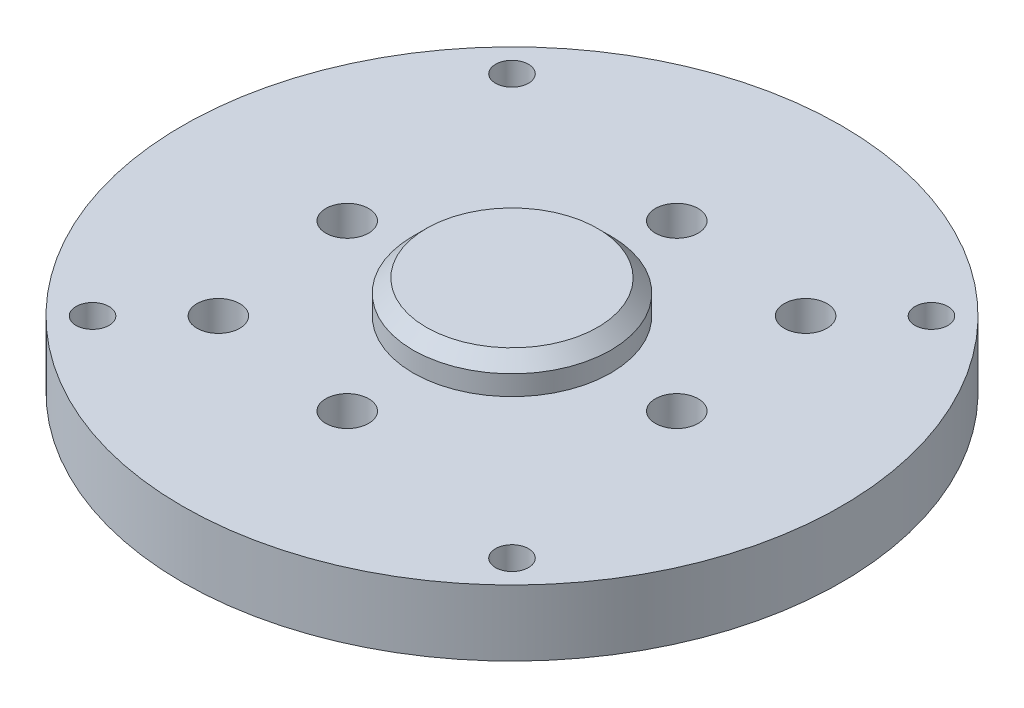
ISO-10303-21;
HEADER;
FILE_DESCRIPTION(('STEP AP214'),'2;1');
FILE_NAME('part.step','',(''),(''),'','','');
FILE_SCHEMA(('AUTOMOTIVE_DESIGN { 1 0 10303 214 1 1 1 1 }'));
ENDSEC;
DATA;
#1=APPLICATION_CONTEXT('core data for automotive mechanical design processes');
#2=APPLICATION_PROTOCOL_DEFINITION('international standard','automotive_design',2000,#1);
#3=PRODUCT_CONTEXT('',#1,'mechanical');
#4=PRODUCT('Part','Part','',(#3));
#5=PRODUCT_RELATED_PRODUCT_CATEGORY('part','',(#4));
#6=PRODUCT_DEFINITION_FORMATION('','',#4);
#7=PRODUCT_DEFINITION_CONTEXT('part definition',#1,'design');
#8=PRODUCT_DEFINITION('design','',#6,#7);
#9=PRODUCT_DEFINITION_SHAPE('','',#8);
#10=(LENGTH_UNIT() NAMED_UNIT(*) SI_UNIT(.MILLI.,.METRE.));
#11=(NAMED_UNIT(*) PLANE_ANGLE_UNIT() SI_UNIT($,.RADIAN.));
#12=(NAMED_UNIT(*) SI_UNIT($,.STERADIAN.) SOLID_ANGLE_UNIT());
#13=UNCERTAINTY_MEASURE_WITH_UNIT(LENGTH_MEASURE(1.E-05),#10,'distance_accuracy_value','');
#14=(GEOMETRIC_REPRESENTATION_CONTEXT(3) GLOBAL_UNCERTAINTY_ASSIGNED_CONTEXT((#13)) GLOBAL_UNIT_ASSIGNED_CONTEXT((#10,
#11,#12)) REPRESENTATION_CONTEXT('',''));
#15=CARTESIAN_POINT('',(0.,0.,0.));
#16=DIRECTION('',(0.,0.,1.));
#17=DIRECTION('',(1.,0.,0.));
#18=AXIS2_PLACEMENT_3D('',#15,#16,#17);
#19=CARTESIAN_POINT('',(0.,0.,0.));
#20=DIRECTION('',(0.,-1.,0.));
#21=DIRECTION('',(0.,0.,-1.));
#22=AXIS2_PLACEMENT_3D('',#19,#20,#21);
#23=PLANE('',#22);
#24=CARTESIAN_POINT('',(0.,0.,-25.));
#25=DIRECTION('',(0.,-1.,0.));
#26=DIRECTION('',(0.,0.,-1.));
#27=AXIS2_PLACEMENT_3D('',#24,#25,#26);
#28=CIRCLE('',#27,6.25);
#29=CARTESIAN_POINT('',(6.11357084178315,0.,-26.29875));
#30=VERTEX_POINT('',#29);
#31=CARTESIAN_POINT('',(-6.11357084178297,0.,-26.29875));
#32=VERTEX_POINT('',#31);
#33=EDGE_CURVE('E188',#30,#32,#28,.T.);
#34=ORIENTED_EDGE('',*,*,#33,.F.);
#35=CARTESIAN_POINT('',(0.,0.,0.));
#36=DIRECTION('',(0.,-1.,0.));
#37=DIRECTION('',(1.,0.,0.));
#38=AXIS2_PLACEMENT_3D('',#35,#36,#37);
#39=CIRCLE('',#38,27.);
#40=CARTESIAN_POINT('',(16.0491407182205,0.,-21.7123255826445));
#41=VERTEX_POINT('',#40);
#42=EDGE_CURVE('E298',#30,#41,#39,.T.);
#43=ORIENTED_EDGE('',*,*,#42,.T.);
#44=CARTESIAN_POINT('',(22.2738636073763,0.,-22.2738636073762));
#45=DIRECTION('',(0.,-1.,0.));
#46=DIRECTION('',(0.,0.,-1.));
#47=AXIS2_PLACEMENT_3D('',#44,#45,#46);
#48=CIRCLE('',#47,6.25);
#49=CARTESIAN_POINT('',(21.7123255826445,0.,-16.0491407182204));
#50=VERTEX_POINT('',#49);
#51=EDGE_CURVE('E182',#50,#41,#48,.T.);
#52=ORIENTED_EDGE('',*,*,#51,.F.);
#53=CARTESIAN_POINT('',(26.29875,0.,-6.11357084178287));
#54=VERTEX_POINT('',#53);
#55=EDGE_CURVE('E294',#50,#54,#39,.T.);
#56=ORIENTED_EDGE('',*,*,#55,.T.);
#57=CARTESIAN_POINT('',(25.,0.,1.71512449944288E-13));
#58=DIRECTION('',(0.,-1.,0.));
#59=DIRECTION('',(0.,0.,-1.));
#60=AXIS2_PLACEMENT_3D('',#57,#58,#59);
#61=CIRCLE('',#60,6.25);
#62=CARTESIAN_POINT('',(26.29875,0.,6.11357084178324));
#63=VERTEX_POINT('',#62);
#64=EDGE_CURVE('E181',#63,#54,#61,.T.);
#65=ORIENTED_EDGE('',*,*,#64,.F.);
#66=CARTESIAN_POINT('',(6.11357084178278,0.,26.2987500000001));
#67=VERTEX_POINT('',#66);
#68=EDGE_CURVE('E139',#63,#67,#39,.T.);
#69=ORIENTED_EDGE('',*,*,#68,.T.);
#70=CARTESIAN_POINT('',(-2.6226893036732E-13,0.,25.));
#71=DIRECTION('',(0.,-1.,0.));
#72=DIRECTION('',(0.,0.,-1.));
#73=AXIS2_PLACEMENT_3D('',#70,#71,#72);
#74=CIRCLE('',#73,6.25);
#75=CARTESIAN_POINT('',(-6.11357084178333,0.,26.2987499999999));
#76=VERTEX_POINT('',#75);
#77=EDGE_CURVE('E171',#76,#67,#74,.T.);
#78=ORIENTED_EDGE('',*,*,#77,.F.);
#79=CARTESIAN_POINT('',(-16.0491407182206,0.,21.7123255826444));
#80=VERTEX_POINT('',#79);
#81=EDGE_CURVE('E59',#76,#80,#39,.T.);
#82=ORIENTED_EDGE('',*,*,#81,.T.);
#83=CARTESIAN_POINT('',(-22.2738636073765,0.,22.2738636073761));
#84=DIRECTION('',(0.,-1.,0.));
#85=DIRECTION('',(0.,0.,-1.));
#86=AXIS2_PLACEMENT_3D('',#83,#84,#85);
#87=CIRCLE('',#86,6.25);
#88=CARTESIAN_POINT('',(-21.7123255826446,0.,16.0491407182203));
#89=VERTEX_POINT('',#88);
#90=EDGE_CURVE('E175',#89,#80,#87,.T.);
#91=ORIENTED_EDGE('',*,*,#90,.F.);
#92=CARTESIAN_POINT('',(-26.29875,0.,6.11357084178306));
#93=VERTEX_POINT('',#92);
#94=EDGE_CURVE('E296',#89,#93,#39,.T.);
#95=ORIENTED_EDGE('',*,*,#94,.T.);
#96=CARTESIAN_POINT('',(-25.,0.,0.));
#97=DIRECTION('',(0.,-1.,0.));
#98=DIRECTION('',(0.,0.,-1.));
#99=AXIS2_PLACEMENT_3D('',#96,#97,#98);
#100=CIRCLE('',#99,6.25);
#101=CARTESIAN_POINT('',(-26.29875,0.,-6.11357084178304));
#102=VERTEX_POINT('',#101);
#103=EDGE_CURVE('E194',#102,#93,#100,.T.);
#104=ORIENTED_EDGE('',*,*,#103,.F.);
#105=EDGE_CURVE('E301',#102,#32,#39,.T.);
#106=ORIENTED_EDGE('',*,*,#105,.T.);
#107=EDGE_LOOP('',(#34,#43,#52,#56,#65,#69,#78,#82,#91,#95,#104,#106));
#108=FACE_BOUND('',#107,.T.);
#109=ADVANCED_FACE('F43',(#108),#23,.T.);
#110=CARTESIAN_POINT('',(-22.2738636073765,5.,22.2738636073761));
#111=DIRECTION('',(0.,-1.,0.));
#112=DIRECTION('',(0.,0.,-1.));
#113=AXIS2_PLACEMENT_3D('',#110,#111,#112);
#114=CYLINDRICAL_SURFACE('',#113,6.25);
#115=CARTESIAN_POINT('',(-22.2738636073765,5.,22.2738636073761));
#116=DIRECTION('',(0.,-1.,0.));
#117=DIRECTION('',(0.,0.,-1.));
#118=AXIS2_PLACEMENT_3D('',#115,#116,#117);
#119=CIRCLE('',#118,6.25);
#120=CARTESIAN_POINT('',(-22.2738636073765,5.,16.0238636073761));
#121=VERTEX_POINT('',#120);
#122=EDGE_CURVE('E197',#121,#121,#119,.T.);
#123=ORIENTED_EDGE('',*,*,#122,.F.);
#124=EDGE_LOOP('',(#123));
#125=FACE_BOUND('',#124,.T.);
#126=DIRECTION('',(0.,-1.,0.));
#127=VECTOR('',#126,1.);
#128=CARTESIAN_POINT('',(-16.0491407182206,2.,21.7123255826444));
#129=LINE('',#128,#127);
#130=CARTESIAN_POINT('',(-16.0491407182206,4.,21.7123255826444));
#131=VERTEX_POINT('',#130);
#132=EDGE_CURVE('E158',#131,#80,#129,.T.);
#133=ORIENTED_EDGE('',*,*,#132,.F.);
#134=CARTESIAN_POINT('',(-22.2738636073765,4.,22.2738636073761));
#135=DIRECTION('',(0.,-1.,0.));
#136=DIRECTION('',(0.,0.,-1.));
#137=AXIS2_PLACEMENT_3D('',#134,#135,#136);
#138=CIRCLE('',#137,6.25);
#139=CARTESIAN_POINT('',(-21.7123255826446,4.,16.0491407182203));
#140=VERTEX_POINT('',#139);
#141=EDGE_CURVE('E169',#140,#131,#138,.F.);
#142=ORIENTED_EDGE('',*,*,#141,.F.);
#143=DIRECTION('',(0.,-1.,0.));
#144=VECTOR('',#143,1.);
#145=CARTESIAN_POINT('',(-21.7123255826446,2.,16.0491407182203));
#146=LINE('',#145,#144);
#147=EDGE_CURVE('E162',#89,#140,#146,.F.);
#148=ORIENTED_EDGE('',*,*,#147,.F.);
#149=ORIENTED_EDGE('',*,*,#90,.T.);
#150=EDGE_LOOP('',(#133,#142,#148,#149));
#151=FACE_BOUND('',#150,.T.);
#152=ADVANCED_FACE('F332',(#125,#151),#114,.F.);
#153=CARTESIAN_POINT('',(22.2738636073763,5.,-22.2738636073762));
#154=DIRECTION('',(0.,-1.,0.));
#155=DIRECTION('',(0.,0.,-1.));
#156=AXIS2_PLACEMENT_3D('',#153,#154,#155);
#157=CYLINDRICAL_SURFACE('',#156,6.25);
#158=CARTESIAN_POINT('',(22.2738636073763,5.,-22.2738636073762));
#159=DIRECTION('',(0.,-1.,0.));
#160=DIRECTION('',(0.,0.,-1.));
#161=AXIS2_PLACEMENT_3D('',#158,#159,#160);
#162=CIRCLE('',#161,6.25);
#163=CARTESIAN_POINT('',(22.2738636073763,5.,-28.5238636073762));
#164=VERTEX_POINT('',#163);
#165=EDGE_CURVE('E178',#164,#164,#162,.T.);
#166=ORIENTED_EDGE('',*,*,#165,.F.);
#167=EDGE_LOOP('',(#166));
#168=FACE_BOUND('',#167,.T.);
#169=DIRECTION('',(0.,-1.,0.));
#170=VECTOR('',#169,1.);
#171=CARTESIAN_POINT('',(16.0491407182205,2.,-21.7123255826445));
#172=LINE('',#171,#170);
#173=CARTESIAN_POINT('',(16.0491407182205,4.,-21.7123255826445));
#174=VERTEX_POINT('',#173);
#175=EDGE_CURVE('E327',#174,#41,#172,.T.);
#176=ORIENTED_EDGE('',*,*,#175,.F.);
#177=CARTESIAN_POINT('',(22.2738636073763,4.,-22.2738636073762));
#178=DIRECTION('',(0.,-1.,0.));
#179=DIRECTION('',(0.,0.,-1.));
#180=AXIS2_PLACEMENT_3D('',#177,#178,#179);
#181=CIRCLE('',#180,6.25);
#182=CARTESIAN_POINT('',(21.7123255826445,4.,-16.0491407182204));
#183=VERTEX_POINT('',#182);
#184=EDGE_CURVE('E167',#183,#174,#181,.F.);
#185=ORIENTED_EDGE('',*,*,#184,.F.);
#186=DIRECTION('',(0.,-1.,0.));
#187=VECTOR('',#186,1.);
#188=CARTESIAN_POINT('',(21.7123255826445,2.,-16.0491407182204));
#189=LINE('',#188,#187);
#190=EDGE_CURVE('E320',#50,#183,#189,.F.);
#191=ORIENTED_EDGE('',*,*,#190,.F.);
#192=ORIENTED_EDGE('',*,*,#51,.T.);
#193=EDGE_LOOP('',(#176,#185,#191,#192));
#194=FACE_BOUND('',#193,.T.);
#195=ADVANCED_FACE('F334',(#168,#194),#157,.F.);
#196=CARTESIAN_POINT('',(-25.,5.,0.));
#197=DIRECTION('',(0.,-1.,0.));
#198=DIRECTION('',(0.,0.,-1.));
#199=AXIS2_PLACEMENT_3D('',#196,#197,#198);
#200=CYLINDRICAL_SURFACE('',#199,6.25);
#201=CARTESIAN_POINT('',(-25.,5.,0.));
#202=DIRECTION('',(0.,-1.,0.));
#203=DIRECTION('',(0.,0.,-1.));
#204=AXIS2_PLACEMENT_3D('',#201,#202,#203);
#205=CIRCLE('',#204,6.25);
#206=CARTESIAN_POINT('',(-25.,5.,-6.25));
#207=VERTEX_POINT('',#206);
#208=EDGE_CURVE('E191',#207,#207,#205,.T.);
#209=ORIENTED_EDGE('',*,*,#208,.F.);
#210=EDGE_LOOP('',(#209));
#211=FACE_BOUND('',#210,.T.);
#212=DIRECTION('',(0.,-1.,0.));
#213=VECTOR('',#212,1.);
#214=CARTESIAN_POINT('',(-26.29875,2.,6.11357084178306));
#215=LINE('',#214,#213);
#216=CARTESIAN_POINT('',(-26.29875,4.,6.11357084178306));
#217=VERTEX_POINT('',#216);
#218=EDGE_CURVE('E313',#217,#93,#215,.T.);
#219=ORIENTED_EDGE('',*,*,#218,.F.);
#220=CARTESIAN_POINT('',(-25.,4.,0.));
#221=DIRECTION('',(0.,-1.,0.));
#222=DIRECTION('',(0.,0.,-1.));
#223=AXIS2_PLACEMENT_3D('',#220,#221,#222);
#224=CIRCLE('',#223,6.25);
#225=CARTESIAN_POINT('',(-26.29875,4.,-6.11357084178304));
#226=VERTEX_POINT('',#225);
#227=EDGE_CURVE('E160',#226,#217,#224,.F.);
#228=ORIENTED_EDGE('',*,*,#227,.F.);
#229=DIRECTION('',(0.,-1.,0.));
#230=VECTOR('',#229,1.);
#231=CARTESIAN_POINT('',(-26.29875,2.,-6.11357084178305));
#232=LINE('',#231,#230);
#233=EDGE_CURVE('E314',#102,#226,#232,.F.);
#234=ORIENTED_EDGE('',*,*,#233,.F.);
#235=ORIENTED_EDGE('',*,*,#103,.T.);
#236=EDGE_LOOP('',(#219,#228,#234,#235));
#237=FACE_BOUND('',#236,.T.);
#238=ADVANCED_FACE('F311',(#211,#237),#200,.F.);
#239=CARTESIAN_POINT('',(0.,5.,-25.));
#240=DIRECTION('',(0.,-1.,0.));
#241=DIRECTION('',(0.,0.,-1.));
#242=AXIS2_PLACEMENT_3D('',#239,#240,#241);
#243=CYLINDRICAL_SURFACE('',#242,6.25);
#244=CARTESIAN_POINT('',(0.,5.,-25.));
#245=DIRECTION('',(0.,-1.,0.));
#246=DIRECTION('',(0.,0.,-1.));
#247=AXIS2_PLACEMENT_3D('',#244,#245,#246);
#248=CIRCLE('',#247,6.25);
#249=CARTESIAN_POINT('',(0.,5.,-31.25));
#250=VERTEX_POINT('',#249);
#251=EDGE_CURVE('E185',#250,#250,#248,.T.);
#252=ORIENTED_EDGE('',*,*,#251,.F.);
#253=EDGE_LOOP('',(#252));
#254=FACE_BOUND('',#253,.T.);
#255=DIRECTION('',(0.,-1.,0.));
#256=VECTOR('',#255,1.);
#257=CARTESIAN_POINT('',(-6.11357084178297,2.,-26.29875));
#258=LINE('',#257,#256);
#259=CARTESIAN_POINT('',(-6.11357084178297,4.,-26.29875));
#260=VERTEX_POINT('',#259);
#261=EDGE_CURVE('E318',#260,#32,#258,.T.);
#262=ORIENTED_EDGE('',*,*,#261,.F.);
#263=CARTESIAN_POINT('',(0.,4.,-25.));
#264=DIRECTION('',(0.,-1.,0.));
#265=DIRECTION('',(0.,0.,-1.));
#266=AXIS2_PLACEMENT_3D('',#263,#264,#265);
#267=CIRCLE('',#266,6.25);
#268=CARTESIAN_POINT('',(6.11357084178315,4.,-26.29875));
#269=VERTEX_POINT('',#268);
#270=EDGE_CURVE('E157',#269,#260,#267,.F.);
#271=ORIENTED_EDGE('',*,*,#270,.F.);
#272=DIRECTION('',(0.,-1.,0.));
#273=VECTOR('',#272,1.);
#274=CARTESIAN_POINT('',(6.11357084178315,2.,-26.29875));
#275=LINE('',#274,#273);
#276=EDGE_CURVE('E322',#30,#269,#275,.F.);
#277=ORIENTED_EDGE('',*,*,#276,.F.);
#278=ORIENTED_EDGE('',*,*,#33,.T.);
#279=EDGE_LOOP('',(#262,#271,#277,#278));
#280=FACE_BOUND('',#279,.T.);
#281=ADVANCED_FACE('F357',(#254,#280),#243,.F.);
#282=CARTESIAN_POINT('',(25.,5.,1.71512449944288E-13));
#283=DIRECTION('',(0.,-1.,0.));
#284=DIRECTION('',(0.,0.,-1.));
#285=AXIS2_PLACEMENT_3D('',#282,#283,#284);
#286=CYLINDRICAL_SURFACE('',#285,6.25);
#287=CARTESIAN_POINT('',(25.,5.,1.71512449944288E-13));
#288=DIRECTION('',(0.,-1.,0.));
#289=DIRECTION('',(0.,0.,-1.));
#290=AXIS2_PLACEMENT_3D('',#287,#288,#289);
#291=CIRCLE('',#290,6.25);
#292=CARTESIAN_POINT('',(25.,5.,-6.24999999999983));
#293=VERTEX_POINT('',#292);
#294=EDGE_CURVE('E202',#293,#293,#291,.T.);
#295=ORIENTED_EDGE('',*,*,#294,.F.);
#296=EDGE_LOOP('',(#295));
#297=FACE_BOUND('',#296,.T.);
#298=DIRECTION('',(0.,-1.,0.));
#299=VECTOR('',#298,1.);
#300=CARTESIAN_POINT('',(26.2987500000001,2.,-6.11357084178288));
#301=LINE('',#300,#299);
#302=CARTESIAN_POINT('',(26.29875,4.,-6.11357084178287));
#303=VERTEX_POINT('',#302);
#304=EDGE_CURVE('E67',#303,#54,#301,.T.);
#305=ORIENTED_EDGE('',*,*,#304,.F.);
#306=CARTESIAN_POINT('',(25.,4.,1.71512449944288E-13));
#307=DIRECTION('',(0.,-1.,0.));
#308=DIRECTION('',(0.,0.,-1.));
#309=AXIS2_PLACEMENT_3D('',#306,#307,#308);
#310=CIRCLE('',#309,6.25);
#311=CARTESIAN_POINT('',(26.29875,4.,6.11357084178324));
#312=VERTEX_POINT('',#311);
#313=EDGE_CURVE('E149',#312,#303,#310,.F.);
#314=ORIENTED_EDGE('',*,*,#313,.F.);
#315=DIRECTION('',(0.,-1.,0.));
#316=VECTOR('',#315,1.);
#317=CARTESIAN_POINT('',(26.29875,2.,6.11357084178324));
#318=LINE('',#317,#316);
#319=EDGE_CURVE('E133',#63,#312,#318,.F.);
#320=ORIENTED_EDGE('',*,*,#319,.F.);
#321=ORIENTED_EDGE('',*,*,#64,.T.);
#322=EDGE_LOOP('',(#305,#314,#320,#321));
#323=FACE_BOUND('',#322,.T.);
#324=ADVANCED_FACE('F156',(#297,#323),#286,.F.);
#325=CARTESIAN_POINT('',(-2.6226893036732E-13,5.,25.));
#326=DIRECTION('',(0.,-1.,0.));
#327=DIRECTION('',(0.,0.,-1.));
#328=AXIS2_PLACEMENT_3D('',#325,#326,#327);
#329=CYLINDRICAL_SURFACE('',#328,6.25);
#330=CARTESIAN_POINT('',(-2.6226893036732E-13,5.,25.));
#331=DIRECTION('',(0.,-1.,0.));
#332=DIRECTION('',(0.,0.,-1.));
#333=AXIS2_PLACEMENT_3D('',#330,#331,#332);
#334=CIRCLE('',#333,6.25);
#335=CARTESIAN_POINT('',(-2.6226893036732E-13,5.,18.75));
#336=VERTEX_POINT('',#335);
#337=EDGE_CURVE('E172',#336,#336,#334,.T.);
#338=ORIENTED_EDGE('',*,*,#337,.F.);
#339=EDGE_LOOP('',(#338));
#340=FACE_BOUND('',#339,.T.);
#341=DIRECTION('',(0.,-1.,0.));
#342=VECTOR('',#341,1.);
#343=CARTESIAN_POINT('',(6.11357084178278,2.,26.2987500000001));
#344=LINE('',#343,#342);
#345=CARTESIAN_POINT('',(6.11357084178278,4.,26.2987500000001));
#346=VERTEX_POINT('',#345);
#347=EDGE_CURVE('E13',#346,#67,#344,.T.);
#348=ORIENTED_EDGE('',*,*,#347,.F.);
#349=CARTESIAN_POINT('',(-2.6226893036732E-13,4.,25.));
#350=DIRECTION('',(0.,-1.,0.));
#351=DIRECTION('',(0.,0.,-1.));
#352=AXIS2_PLACEMENT_3D('',#349,#350,#351);
#353=CIRCLE('',#352,6.25);
#354=CARTESIAN_POINT('',(-6.11357084178333,4.,26.2987499999999));
#355=VERTEX_POINT('',#354);
#356=EDGE_CURVE('E52',#355,#346,#353,.F.);
#357=ORIENTED_EDGE('',*,*,#356,.F.);
#358=DIRECTION('',(0.,-1.,0.));
#359=VECTOR('',#358,1.);
#360=CARTESIAN_POINT('',(-6.11357084178333,2.,26.2987499999999));
#361=LINE('',#360,#359);
#362=EDGE_CURVE('E281',#76,#355,#361,.F.);
#363=ORIENTED_EDGE('',*,*,#362,.F.);
#364=ORIENTED_EDGE('',*,*,#77,.T.);
#365=EDGE_LOOP('',(#348,#357,#363,#364));
#366=FACE_BOUND('',#365,.T.);
#367=ADVANCED_FACE('F290',(#340,#366),#329,.F.);
#368=CARTESIAN_POINT('',(-2.6226893036732E-13,0.,25.));
#369=DIRECTION('',(0.,1.,0.));
#370=DIRECTION('',(0.,0.,1.));
#371=AXIS2_PLACEMENT_3D('',#368,#369,#370);
#372=CYLINDRICAL_SURFACE('',#371,3.25);
#373=CARTESIAN_POINT('',(-2.6226893036732E-13,10.,25.));
#374=DIRECTION('',(0.,1.,0.));
#375=DIRECTION('',(0.,0.,1.));
#376=AXIS2_PLACEMENT_3D('',#373,#374,#375);
#377=CIRCLE('',#376,3.25);
#378=CARTESIAN_POINT('',(-2.6226893036732E-13,10.,28.25));
#379=VERTEX_POINT('',#378);
#380=EDGE_CURVE('E241',#379,#379,#377,.T.);
#381=ORIENTED_EDGE('',*,*,#380,.T.);
#382=EDGE_LOOP('',(#381));
#383=FACE_BOUND('',#382,.T.);
#384=CARTESIAN_POINT('',(-2.6226893036732E-13,5.,25.));
#385=DIRECTION('',(0.,-1.,0.));
#386=DIRECTION('',(0.,0.,-1.));
#387=AXIS2_PLACEMENT_3D('',#384,#385,#386);
#388=CIRCLE('',#387,3.25);
#389=CARTESIAN_POINT('',(-2.6226893036732E-13,5.,21.75));
#390=VERTEX_POINT('',#389);
#391=EDGE_CURVE('E214',#390,#390,#388,.F.);
#392=ORIENTED_EDGE('',*,*,#391,.F.);
#393=EDGE_LOOP('',(#392));
#394=FACE_BOUND('',#393,.T.);
#395=ADVANCED_FACE('F399',(#383,#394),#372,.F.);
#396=CARTESIAN_POINT('',(25.,0.,1.71512449944288E-13));
#397=DIRECTION('',(0.,1.,0.));
#398=DIRECTION('',(0.,0.,1.));
#399=AXIS2_PLACEMENT_3D('',#396,#397,#398);
#400=CYLINDRICAL_SURFACE('',#399,3.25);
#401=CARTESIAN_POINT('',(25.,10.,1.71512449944288E-13));
#402=DIRECTION('',(0.,1.,0.));
#403=DIRECTION('',(0.,0.,1.));
#404=AXIS2_PLACEMENT_3D('',#401,#402,#403);
#405=CIRCLE('',#404,3.25);
#406=CARTESIAN_POINT('',(25.,10.,3.25000000000017));
#407=VERTEX_POINT('',#406);
#408=EDGE_CURVE('E249',#407,#407,#405,.T.);
#409=ORIENTED_EDGE('',*,*,#408,.T.);
#410=EDGE_LOOP('',(#409));
#411=FACE_BOUND('',#410,.T.);
#412=CARTESIAN_POINT('',(25.,5.,1.71512449944288E-13));
#413=DIRECTION('',(0.,-1.,0.));
#414=DIRECTION('',(0.,0.,-1.));
#415=AXIS2_PLACEMENT_3D('',#412,#413,#414);
#416=CIRCLE('',#415,3.25);
#417=CARTESIAN_POINT('',(25.,5.,-3.24999999999983));
#418=VERTEX_POINT('',#417);
#419=EDGE_CURVE('E268',#418,#418,#416,.F.);
#420=ORIENTED_EDGE('',*,*,#419,.F.);
#421=EDGE_LOOP('',(#420));
#422=FACE_BOUND('',#421,.T.);
#423=ADVANCED_FACE('F395',(#411,#422),#400,.F.);
#424=CARTESIAN_POINT('',(0.,0.,-25.));
#425=DIRECTION('',(0.,1.,0.));
#426=DIRECTION('',(0.,0.,1.));
#427=AXIS2_PLACEMENT_3D('',#424,#425,#426);
#428=CYLINDRICAL_SURFACE('',#427,3.25);
#429=CARTESIAN_POINT('',(0.,10.,-25.));
#430=DIRECTION('',(0.,1.,0.));
#431=DIRECTION('',(0.,0.,1.));
#432=AXIS2_PLACEMENT_3D('',#429,#430,#431);
#433=CIRCLE('',#432,3.25);
#434=CARTESIAN_POINT('',(0.,10.,-21.75));
#435=VERTEX_POINT('',#434);
#436=EDGE_CURVE('E246',#435,#435,#433,.T.);
#437=ORIENTED_EDGE('',*,*,#436,.T.);
#438=EDGE_LOOP('',(#437));
#439=FACE_BOUND('',#438,.T.);
#440=CARTESIAN_POINT('',(0.,5.,-25.));
#441=DIRECTION('',(0.,-1.,0.));
#442=DIRECTION('',(0.,0.,-1.));
#443=AXIS2_PLACEMENT_3D('',#440,#441,#442);
#444=CIRCLE('',#443,3.25);
#445=CARTESIAN_POINT('',(0.,5.,-28.25));
#446=VERTEX_POINT('',#445);
#447=EDGE_CURVE('E265',#446,#446,#444,.F.);
#448=ORIENTED_EDGE('',*,*,#447,.F.);
#449=EDGE_LOOP('',(#448));
#450=FACE_BOUND('',#449,.T.);
#451=ADVANCED_FACE('F391',(#439,#450),#428,.F.);
#452=CARTESIAN_POINT('',(-25.,0.,0.));
#453=DIRECTION('',(0.,1.,0.));
#454=DIRECTION('',(0.,0.,1.));
#455=AXIS2_PLACEMENT_3D('',#452,#453,#454);
#456=CYLINDRICAL_SURFACE('',#455,3.25);
#457=CARTESIAN_POINT('',(-25.,10.,0.));
#458=DIRECTION('',(0.,1.,0.));
#459=DIRECTION('',(0.,0.,1.));
#460=AXIS2_PLACEMENT_3D('',#457,#458,#459);
#461=CIRCLE('',#460,3.25);
#462=CARTESIAN_POINT('',(-25.,10.,3.25));
#463=VERTEX_POINT('',#462);
#464=EDGE_CURVE('E242',#463,#463,#461,.T.);
#465=ORIENTED_EDGE('',*,*,#464,.T.);
#466=EDGE_LOOP('',(#465));
#467=FACE_BOUND('',#466,.T.);
#468=CARTESIAN_POINT('',(-25.,5.,0.));
#469=DIRECTION('',(0.,-1.,0.));
#470=DIRECTION('',(0.,0.,-1.));
#471=AXIS2_PLACEMENT_3D('',#468,#469,#470);
#472=CIRCLE('',#471,3.25);
#473=CARTESIAN_POINT('',(-25.,5.,-3.25));
#474=VERTEX_POINT('',#473);
#475=EDGE_CURVE('E262',#474,#474,#472,.F.);
#476=ORIENTED_EDGE('',*,*,#475,.F.);
#477=EDGE_LOOP('',(#476));
#478=FACE_BOUND('',#477,.T.);
#479=ADVANCED_FACE('F367',(#467,#478),#456,.F.);
#480=CARTESIAN_POINT('',(22.2738636073763,10.,-22.2738636073762));
#481=DIRECTION('',(0.,-1.,0.));
#482=DIRECTION('',(0.,0.,-1.));
#483=AXIS2_PLACEMENT_3D('',#480,#481,#482);
#484=CYLINDRICAL_SURFACE('',#483,3.25);
#485=CARTESIAN_POINT('',(22.2738636073763,10.,-22.2738636073762));
#486=DIRECTION('',(0.,-1.,0.));
#487=DIRECTION('',(0.,0.,-1.));
#488=AXIS2_PLACEMENT_3D('',#485,#486,#487);
#489=CIRCLE('',#488,3.25);
#490=CARTESIAN_POINT('',(22.2738636073763,10.,-25.5238636073762));
#491=VERTEX_POINT('',#490);
#492=EDGE_CURVE('E211',#491,#491,#489,.T.);
#493=ORIENTED_EDGE('',*,*,#492,.F.);
#494=EDGE_LOOP('',(#493));
#495=FACE_BOUND('',#494,.T.);
#496=CARTESIAN_POINT('',(22.2738636073763,5.,-22.2738636073762));
#497=DIRECTION('',(0.,-1.,0.));
#498=DIRECTION('',(0.,0.,-1.));
#499=AXIS2_PLACEMENT_3D('',#496,#497,#498);
#500=CIRCLE('',#499,3.25);
#501=CARTESIAN_POINT('',(22.2738636073763,5.,-25.5238636073762));
#502=VERTEX_POINT('',#501);
#503=EDGE_CURVE('E259',#502,#502,#500,.F.);
#504=ORIENTED_EDGE('',*,*,#503,.F.);
#505=EDGE_LOOP('',(#504));
#506=FACE_BOUND('',#505,.T.);
#507=ADVANCED_FACE('F363',(#495,#506),#484,.F.);
#508=CARTESIAN_POINT('',(-22.2738636073765,10.,22.2738636073761));
#509=DIRECTION('',(0.,-1.,0.));
#510=DIRECTION('',(0.,0.,-1.));
#511=AXIS2_PLACEMENT_3D('',#508,#509,#510);
#512=CYLINDRICAL_SURFACE('',#511,3.25);
#513=CARTESIAN_POINT('',(-22.2738636073765,10.,22.2738636073761));
#514=DIRECTION('',(0.,-1.,0.));
#515=DIRECTION('',(0.,0.,-1.));
#516=AXIS2_PLACEMENT_3D('',#513,#514,#515);
#517=CIRCLE('',#516,3.25);
#518=CARTESIAN_POINT('',(-22.2738636073765,10.,19.0238636073761));
#519=VERTEX_POINT('',#518);
#520=EDGE_CURVE('E207',#519,#519,#517,.T.);
#521=ORIENTED_EDGE('',*,*,#520,.F.);
#522=EDGE_LOOP('',(#521));
#523=FACE_BOUND('',#522,.T.);
#524=CARTESIAN_POINT('',(-22.2738636073765,5.,22.2738636073761));
#525=DIRECTION('',(0.,-1.,0.));
#526=DIRECTION('',(0.,0.,-1.));
#527=AXIS2_PLACEMENT_3D('',#524,#525,#526);
#528=CIRCLE('',#527,3.25);
#529=CARTESIAN_POINT('',(-22.2738636073765,5.,19.0238636073761));
#530=VERTEX_POINT('',#529);
#531=EDGE_CURVE('E205',#530,#530,#528,.F.);
#532=ORIENTED_EDGE('',*,*,#531,.F.);
#533=EDGE_LOOP('',(#532));
#534=FACE_BOUND('',#533,.T.);
#535=ADVANCED_FACE('F359',(#523,#534),#512,.F.);
#536=CARTESIAN_POINT('',(0.,10.,0.));
#537=DIRECTION('',(0.,-1.,0.));
#538=DIRECTION('',(0.,0.,-1.));
#539=AXIS2_PLACEMENT_3D('',#536,#537,#538);
#540=PLANE('',#539);
#541=CARTESIAN_POINT('',(0.,10.,0.));
#542=DIRECTION('',(0.,-1.,0.));
#543=DIRECTION('',(0.,0.,-1.));
#544=AXIS2_PLACEMENT_3D('',#541,#542,#543);
#545=CIRCLE('',#544,15.);
#546=CARTESIAN_POINT('',(0.,10.,-15.));
#547=VERTEX_POINT('',#546);
#548=EDGE_CURVE('E256',#547,#547,#545,.F.);
#549=ORIENTED_EDGE('',*,*,#548,.F.);
#550=EDGE_LOOP('',(#549));
#551=FACE_BOUND('',#550,.T.);
#552=ORIENTED_EDGE('',*,*,#520,.T.);
#553=EDGE_LOOP('',(#552));
#554=FACE_BOUND('',#553,.T.);
#555=ORIENTED_EDGE('',*,*,#492,.T.);
#556=EDGE_LOOP('',(#555));
#557=FACE_BOUND('',#556,.T.);
#558=CARTESIAN_POINT('',(-31.8198051533929,10.,31.8198051533946));
#559=DIRECTION('',(0.,1.,0.));
#560=DIRECTION('',(0.,0.,1.));
#561=AXIS2_PLACEMENT_3D('',#558,#559,#560);
#562=CIRCLE('',#561,2.50000000000095);
#563=CARTESIAN_POINT('',(-31.8198051533929,10.,34.3198051533955));
#564=VERTEX_POINT('',#563);
#565=EDGE_CURVE('E228',#564,#564,#562,.T.);
#566=ORIENTED_EDGE('',*,*,#565,.F.);
#567=EDGE_LOOP('',(#566));
#568=FACE_BOUND('',#567,.T.);
#569=CARTESIAN_POINT('',(31.8198051533964,10.,31.8198051533929));
#570=DIRECTION('',(0.,1.,0.));
#571=DIRECTION('',(0.,0.,1.));
#572=AXIS2_PLACEMENT_3D('',#569,#570,#571);
#573=CIRCLE('',#572,2.50000000000252);
#574=CARTESIAN_POINT('',(31.8198051533964,10.,34.3198051533954));
#575=VERTEX_POINT('',#574);
#576=EDGE_CURVE('E222',#575,#575,#573,.T.);
#577=ORIENTED_EDGE('',*,*,#576,.F.);
#578=EDGE_LOOP('',(#577));
#579=FACE_BOUND('',#578,.T.);
#580=CARTESIAN_POINT('',(31.8198051533947,10.,-31.8198051533964));
#581=DIRECTION('',(0.,1.,0.));
#582=DIRECTION('',(0.,0.,1.));
#583=AXIS2_PLACEMENT_3D('',#580,#581,#582);
#584=CIRCLE('',#583,2.50000000000184);
#585=CARTESIAN_POINT('',(31.8198051533947,10.,-29.3198051533945));
#586=VERTEX_POINT('',#585);
#587=EDGE_CURVE('E215',#586,#586,#584,.T.);
#588=ORIENTED_EDGE('',*,*,#587,.F.);
#589=EDGE_LOOP('',(#588));
#590=FACE_BOUND('',#589,.T.);
#591=CARTESIAN_POINT('',(-31.8198051533946,10.,-31.8198051533947));
#592=DIRECTION('',(0.,1.,0.));
#593=DIRECTION('',(0.,0.,1.));
#594=AXIS2_PLACEMENT_3D('',#591,#592,#593);
#595=CIRCLE('',#594,2.5);
#596=CARTESIAN_POINT('',(-31.8198051533946,10.,-29.3198051533947));
#597=VERTEX_POINT('',#596);
#598=EDGE_CURVE('E218',#597,#597,#595,.T.);
#599=ORIENTED_EDGE('',*,*,#598,.F.);
#600=EDGE_LOOP('',(#599));
#601=FACE_BOUND('',#600,.T.);
#602=ORIENTED_EDGE('',*,*,#464,.F.);
#603=EDGE_LOOP('',(#602));
#604=FACE_BOUND('',#603,.T.);
#605=ORIENTED_EDGE('',*,*,#436,.F.);
#606=EDGE_LOOP('',(#605));
#607=FACE_BOUND('',#606,.T.);
#608=ORIENTED_EDGE('',*,*,#408,.F.);
#609=EDGE_LOOP('',(#608));
#610=FACE_BOUND('',#609,.T.);
#611=ORIENTED_EDGE('',*,*,#380,.F.);
#612=EDGE_LOOP('',(#611));
#613=FACE_BOUND('',#612,.T.);
#614=CARTESIAN_POINT('',(0.,10.,0.));
#615=DIRECTION('',(0.,1.,0.));
#616=DIRECTION('',(0.,0.,1.));
#617=AXIS2_PLACEMENT_3D('',#614,#615,#616);
#618=CIRCLE('',#617,50.);
#619=CARTESIAN_POINT('',(0.,10.,50.));
#620=VERTEX_POINT('',#619);
#621=EDGE_CURVE('E236',#620,#620,#618,.T.);
#622=ORIENTED_EDGE('',*,*,#621,.T.);
#623=EDGE_LOOP('',(#622));
#624=FACE_BOUND('',#623,.T.);
#625=ADVANCED_FACE('F362',(#551,#554,#557,#568,#579,#590,#601,#604,#607,#610,#613,#624),#540,.F.);
#626=CARTESIAN_POINT('',(0.,0.,0.));
#627=DIRECTION('',(0.,-1.,0.));
#628=DIRECTION('',(1.,0.,0.));
#629=AXIS2_PLACEMENT_3D('',#626,#627,#628);
#630=CIRCLE('',#629,41.);
#631=CARTESIAN_POINT('',(41.,0.,0.));
#632=VERTEX_POINT('',#631);
#633=EDGE_CURVE('E152',#632,#632,#630,.T.);
#634=ORIENTED_EDGE('',*,*,#633,.F.);
#635=EDGE_LOOP('',(#634));
#636=FACE_BOUND('',#635,.T.);
#637=CARTESIAN_POINT('',(-31.8198051533929,0.,31.8198051533946));
#638=DIRECTION('',(0.,1.,0.));
#639=DIRECTION('',(0.,0.,1.));
#640=AXIS2_PLACEMENT_3D('',#637,#638,#639);
#641=CIRCLE('',#640,2.50000000000095);
#642=CARTESIAN_POINT('',(-31.8198051533929,0.,34.3198051533955));
#643=VERTEX_POINT('',#642);
#644=EDGE_CURVE('E210',#643,#643,#641,.T.);
#645=ORIENTED_EDGE('',*,*,#644,.T.);
#646=EDGE_LOOP('',(#645));
#647=FACE_BOUND('',#646,.T.);
#648=CARTESIAN_POINT('',(31.8198051533964,0.,31.8198051533929));
#649=DIRECTION('',(0.,1.,0.));
#650=DIRECTION('',(0.,0.,1.));
#651=AXIS2_PLACEMENT_3D('',#648,#649,#650);
#652=CIRCLE('',#651,2.50000000000252);
#653=CARTESIAN_POINT('',(31.8198051533964,0.,34.3198051533954));
#654=VERTEX_POINT('',#653);
#655=EDGE_CURVE('E225',#654,#654,#652,.T.);
#656=ORIENTED_EDGE('',*,*,#655,.T.);
#657=EDGE_LOOP('',(#656));
#658=FACE_BOUND('',#657,.T.);
#659=CARTESIAN_POINT('',(31.8198051533947,0.,-31.8198051533964));
#660=DIRECTION('',(0.,1.,0.));
#661=DIRECTION('',(0.,0.,1.));
#662=AXIS2_PLACEMENT_3D('',#659,#660,#661);
#663=CIRCLE('',#662,2.50000000000184);
#664=CARTESIAN_POINT('',(31.8198051533947,0.,-29.3198051533945));
#665=VERTEX_POINT('',#664);
#666=EDGE_CURVE('E219',#665,#665,#663,.T.);
#667=ORIENTED_EDGE('',*,*,#666,.T.);
#668=EDGE_LOOP('',(#667));
#669=FACE_BOUND('',#668,.T.);
#670=CARTESIAN_POINT('',(-31.8198051533946,0.,-31.8198051533947));
#671=DIRECTION('',(0.,1.,0.));
#672=DIRECTION('',(0.,0.,1.));
#673=AXIS2_PLACEMENT_3D('',#670,#671,#672);
#674=CIRCLE('',#673,2.5);
#675=CARTESIAN_POINT('',(-31.8198051533946,0.,-29.3198051533947));
#676=VERTEX_POINT('',#675);
#677=EDGE_CURVE('E233',#676,#676,#674,.T.);
#678=ORIENTED_EDGE('',*,*,#677,.T.);
#679=EDGE_LOOP('',(#678));
#680=FACE_BOUND('',#679,.T.);
#681=CARTESIAN_POINT('',(0.,0.,0.));
#682=DIRECTION('',(0.,-1.,0.));
#683=DIRECTION('',(0.,0.,-1.));
#684=AXIS2_PLACEMENT_3D('',#681,#682,#683);
#685=CIRCLE('',#684,50.);
#686=CARTESIAN_POINT('',(0.,0.,-50.));
#687=VERTEX_POINT('',#686);
#688=EDGE_CURVE('E245',#687,#687,#685,.T.);
#689=ORIENTED_EDGE('',*,*,#688,.T.);
#690=EDGE_LOOP('',(#689));
#691=FACE_BOUND('',#690,.T.);
#692=ADVANCED_FACE('F343',(#636,#647,#658,#669,#680,#691),#23,.T.);
#693=CARTESIAN_POINT('',(0.,0.,0.));
#694=DIRECTION('',(0.,1.,0.));
#695=DIRECTION('',(0.,0.,1.));
#696=AXIS2_PLACEMENT_3D('',#693,#694,#695);
#697=CYLINDRICAL_SURFACE('',#696,50.);
#698=ORIENTED_EDGE('',*,*,#621,.F.);
#699=EDGE_LOOP('',(#698));
#700=FACE_BOUND('',#699,.T.);
#701=ORIENTED_EDGE('',*,*,#688,.F.);
#702=EDGE_LOOP('',(#701));
#703=FACE_BOUND('',#702,.T.);
#704=ADVANCED_FACE('F384',(#700,#703),#697,.T.);
#705=CARTESIAN_POINT('',(-31.8198051533946,0.,-31.8198051533947));
#706=DIRECTION('',(0.,1.,0.));
#707=DIRECTION('',(0.,0.,1.));
#708=AXIS2_PLACEMENT_3D('',#705,#706,#707);
#709=CYLINDRICAL_SURFACE('',#708,2.5);
#710=ORIENTED_EDGE('',*,*,#677,.F.);
#711=EDGE_LOOP('',(#710));
#712=FACE_BOUND('',#711,.T.);
#713=ORIENTED_EDGE('',*,*,#598,.T.);
#714=EDGE_LOOP('',(#713));
#715=FACE_BOUND('',#714,.T.);
#716=ADVANCED_FACE('F373',(#712,#715),#709,.F.);
#717=CARTESIAN_POINT('',(31.8198051533947,0.,-31.8198051533964));
#718=DIRECTION('',(0.,1.,0.));
#719=DIRECTION('',(0.,0.,1.));
#720=AXIS2_PLACEMENT_3D('',#717,#718,#719);
#721=CYLINDRICAL_SURFACE('',#720,2.50000000000184);
#722=ORIENTED_EDGE('',*,*,#666,.F.);
#723=EDGE_LOOP('',(#722));
#724=FACE_BOUND('',#723,.T.);
#725=ORIENTED_EDGE('',*,*,#587,.T.);
#726=EDGE_LOOP('',(#725));
#727=FACE_BOUND('',#726,.T.);
#728=ADVANCED_FACE('F369',(#724,#727),#721,.F.);
#729=CARTESIAN_POINT('',(31.8198051533964,0.,31.8198051533929));
#730=DIRECTION('',(0.,1.,0.));
#731=DIRECTION('',(0.,0.,1.));
#732=AXIS2_PLACEMENT_3D('',#729,#730,#731);
#733=CYLINDRICAL_SURFACE('',#732,2.50000000000252);
#734=ORIENTED_EDGE('',*,*,#655,.F.);
#735=EDGE_LOOP('',(#734));
#736=FACE_BOUND('',#735,.T.);
#737=ORIENTED_EDGE('',*,*,#576,.T.);
#738=EDGE_LOOP('',(#737));
#739=FACE_BOUND('',#738,.T.);
#740=ADVANCED_FACE('F372',(#736,#739),#733,.F.);
#741=CARTESIAN_POINT('',(-31.8198051533929,0.,31.8198051533946));
#742=DIRECTION('',(0.,1.,0.));
#743=DIRECTION('',(0.,0.,1.));
#744=AXIS2_PLACEMENT_3D('',#741,#742,#743);
#745=CYLINDRICAL_SURFACE('',#744,2.50000000000095);
#746=ORIENTED_EDGE('',*,*,#644,.F.);
#747=EDGE_LOOP('',(#746));
#748=FACE_BOUND('',#747,.T.);
#749=ORIENTED_EDGE('',*,*,#565,.T.);
#750=EDGE_LOOP('',(#749));
#751=FACE_BOUND('',#750,.T.);
#752=ADVANCED_FACE('F377',(#748,#751),#745,.F.);
#753=CARTESIAN_POINT('',(-22.2738636073765,5.,22.2738636073761));
#754=DIRECTION('',(0.,-1.,0.));
#755=DIRECTION('',(0.,0.,-1.));
#756=AXIS2_PLACEMENT_3D('',#753,#754,#755);
#757=PLANE('',#756);
#758=ORIENTED_EDGE('',*,*,#122,.T.);
#759=EDGE_LOOP('',(#758));
#760=FACE_BOUND('',#759,.T.);
#761=ORIENTED_EDGE('',*,*,#531,.T.);
#762=EDGE_LOOP('',(#761));
#763=FACE_BOUND('',#762,.T.);
#764=ADVANCED_FACE('F347',(#760,#763),#757,.T.);
#765=CARTESIAN_POINT('',(22.2738636073763,5.,-22.2738636073762));
#766=DIRECTION('',(0.,-1.,0.));
#767=DIRECTION('',(0.,0.,-1.));
#768=AXIS2_PLACEMENT_3D('',#765,#766,#767);
#769=PLANE('',#768);
#770=ORIENTED_EDGE('',*,*,#165,.T.);
#771=EDGE_LOOP('',(#770));
#772=FACE_BOUND('',#771,.T.);
#773=ORIENTED_EDGE('',*,*,#503,.T.);
#774=EDGE_LOOP('',(#773));
#775=FACE_BOUND('',#774,.T.);
#776=ADVANCED_FACE('F454',(#772,#775),#769,.T.);
#777=CARTESIAN_POINT('',(-25.,5.,0.));
#778=DIRECTION('',(0.,-1.,0.));
#779=DIRECTION('',(0.,0.,-1.));
#780=AXIS2_PLACEMENT_3D('',#777,#778,#779);
#781=PLANE('',#780);
#782=ORIENTED_EDGE('',*,*,#208,.T.);
#783=EDGE_LOOP('',(#782));
#784=FACE_BOUND('',#783,.T.);
#785=ORIENTED_EDGE('',*,*,#475,.T.);
#786=EDGE_LOOP('',(#785));
#787=FACE_BOUND('',#786,.T.);
#788=ADVANCED_FACE('F456',(#784,#787),#781,.T.);
#789=CARTESIAN_POINT('',(0.,5.,-25.));
#790=DIRECTION('',(0.,-1.,0.));
#791=DIRECTION('',(0.,0.,-1.));
#792=AXIS2_PLACEMENT_3D('',#789,#790,#791);
#793=PLANE('',#792);
#794=ORIENTED_EDGE('',*,*,#251,.T.);
#795=EDGE_LOOP('',(#794));
#796=FACE_BOUND('',#795,.T.);
#797=ORIENTED_EDGE('',*,*,#447,.T.);
#798=EDGE_LOOP('',(#797));
#799=FACE_BOUND('',#798,.T.);
#800=ADVANCED_FACE('F353',(#796,#799),#793,.T.);
#801=CARTESIAN_POINT('',(25.,5.,1.71512449944288E-13));
#802=DIRECTION('',(0.,-1.,0.));
#803=DIRECTION('',(0.,0.,-1.));
#804=AXIS2_PLACEMENT_3D('',#801,#802,#803);
#805=PLANE('',#804);
#806=ORIENTED_EDGE('',*,*,#294,.T.);
#807=EDGE_LOOP('',(#806));
#808=FACE_BOUND('',#807,.T.);
#809=ORIENTED_EDGE('',*,*,#419,.T.);
#810=EDGE_LOOP('',(#809));
#811=FACE_BOUND('',#810,.T.);
#812=ADVANCED_FACE('F349',(#808,#811),#805,.T.);
#813=CARTESIAN_POINT('',(-2.6226893036732E-13,5.,25.));
#814=DIRECTION('',(0.,-1.,0.));
#815=DIRECTION('',(0.,0.,-1.));
#816=AXIS2_PLACEMENT_3D('',#813,#814,#815);
#817=PLANE('',#816);
#818=ORIENTED_EDGE('',*,*,#337,.T.);
#819=EDGE_LOOP('',(#818));
#820=FACE_BOUND('',#819,.T.);
#821=ORIENTED_EDGE('',*,*,#391,.T.);
#822=EDGE_LOOP('',(#821));
#823=FACE_BOUND('',#822,.T.);
#824=ADVANCED_FACE('F352',(#820,#823),#817,.T.);
#825=CARTESIAN_POINT('',(0.,15.,0.));
#826=DIRECTION('',(0.,-1.,0.));
#827=DIRECTION('',(0.,0.,-1.));
#828=AXIS2_PLACEMENT_3D('',#825,#826,#827);
#829=CYLINDRICAL_SURFACE('',#828,15.);
#830=CARTESIAN_POINT('',(0.,13.,0.));
#831=DIRECTION('',(0.,1.,0.));
#832=DIRECTION('',(0.,0.,1.));
#833=AXIS2_PLACEMENT_3D('',#830,#831,#832);
#834=CIRCLE('',#833,15.);
#835=CARTESIAN_POINT('',(0.,13.,15.));
#836=VERTEX_POINT('',#835);
#837=EDGE_CURVE('E278',#836,#836,#834,.F.);
#838=ORIENTED_EDGE('',*,*,#837,.T.);
#839=EDGE_LOOP('',(#838));
#840=FACE_BOUND('',#839,.T.);
#841=ORIENTED_EDGE('',*,*,#548,.T.);
#842=EDGE_LOOP('',(#841));
#843=FACE_BOUND('',#842,.T.);
#844=ADVANCED_FACE('F440',(#840,#843),#829,.T.);
#845=CARTESIAN_POINT('',(0.,15.,0.));
#846=DIRECTION('',(0.,1.,0.));
#847=DIRECTION('',(0.,0.,1.));
#848=AXIS2_PLACEMENT_3D('',#845,#846,#847);
#849=PLANE('',#848);
#850=CARTESIAN_POINT('',(0.,15.,0.));
#851=DIRECTION('',(0.,1.,0.));
#852=DIRECTION('',(0.,0.,1.));
#853=AXIS2_PLACEMENT_3D('',#850,#851,#852);
#854=CIRCLE('',#853,13.);
#855=CARTESIAN_POINT('',(0.,15.,13.));
#856=VERTEX_POINT('',#855);
#857=EDGE_CURVE('E275',#856,#856,#854,.T.);
#858=ORIENTED_EDGE('',*,*,#857,.T.);
#859=EDGE_LOOP('',(#858));
#860=FACE_BOUND('',#859,.T.);
#861=ADVANCED_FACE('F446',(#860),#849,.T.);
#862=CARTESIAN_POINT('',(0.,15.,0.));
#863=DIRECTION('',(0.,-1.,0.));
#864=DIRECTION('',(0.,0.,-1.));
#865=AXIS2_PLACEMENT_3D('',#862,#863,#864);
#866=CONICAL_SURFACE('',#865,13.,0.785398163397446);
#867=ORIENTED_EDGE('',*,*,#837,.F.);
#868=EDGE_LOOP('',(#867));
#869=FACE_BOUND('',#868,.T.);
#870=ORIENTED_EDGE('',*,*,#857,.F.);
#871=EDGE_LOOP('',(#870));
#872=FACE_BOUND('',#871,.T.);
#873=ADVANCED_FACE('F46',(#869,#872),#866,.T.);
#874=CARTESIAN_POINT('',(0.,4.,0.));
#875=DIRECTION('',(0.,-1.,0.));
#876=DIRECTION('',(0.,0.,-1.));
#877=AXIS2_PLACEMENT_3D('',#874,#875,#876);
#878=PLANE('',#877);
#879=CARTESIAN_POINT('',(0.,4.,0.));
#880=DIRECTION('',(0.,-1.,0.));
#881=DIRECTION('',(1.,0.,0.));
#882=AXIS2_PLACEMENT_3D('',#879,#880,#881);
#883=CIRCLE('',#882,41.);
#884=CARTESIAN_POINT('',(41.,4.,0.));
#885=VERTEX_POINT('',#884);
#886=EDGE_CURVE('E144',#885,#885,#883,.T.);
#887=ORIENTED_EDGE('',*,*,#886,.T.);
#888=EDGE_LOOP('',(#887));
#889=FACE_BOUND('',#888,.T.);
#890=ORIENTED_EDGE('',*,*,#141,.T.);
#891=CARTESIAN_POINT('',(0.,4.,0.));
#892=DIRECTION('',(0.,-1.,0.));
#893=DIRECTION('',(1.,0.,0.));
#894=AXIS2_PLACEMENT_3D('',#891,#892,#893);
#895=CIRCLE('',#894,27.);
#896=EDGE_CURVE('E153',#355,#131,#895,.T.);
#897=ORIENTED_EDGE('',*,*,#896,.F.);
#898=ORIENTED_EDGE('',*,*,#356,.T.);
#899=EDGE_CURVE('E136',#312,#346,#895,.T.);
#900=ORIENTED_EDGE('',*,*,#899,.F.);
#901=ORIENTED_EDGE('',*,*,#313,.T.);
#902=EDGE_CURVE('E155',#183,#303,#895,.T.);
#903=ORIENTED_EDGE('',*,*,#902,.F.);
#904=ORIENTED_EDGE('',*,*,#184,.T.);
#905=EDGE_CURVE('E295',#269,#174,#895,.T.);
#906=ORIENTED_EDGE('',*,*,#905,.F.);
#907=ORIENTED_EDGE('',*,*,#270,.T.);
#908=EDGE_CURVE('E331',#226,#260,#895,.T.);
#909=ORIENTED_EDGE('',*,*,#908,.F.);
#910=ORIENTED_EDGE('',*,*,#227,.T.);
#911=EDGE_CURVE('E289',#140,#217,#895,.T.);
#912=ORIENTED_EDGE('',*,*,#911,.F.);
#913=EDGE_LOOP('',(#890,#897,#898,#900,#901,#903,#904,#906,#907,#909,#910,#912));
#914=FACE_BOUND('',#913,.T.);
#915=ADVANCED_FACE('F147',(#889,#914),#878,.T.);
#916=CARTESIAN_POINT('',(0.,4.,0.));
#917=DIRECTION('',(0.,-1.,0.));
#918=DIRECTION('',(0.,0.,-1.));
#919=AXIS2_PLACEMENT_3D('',#916,#917,#918);
#920=CYLINDRICAL_SURFACE('',#919,27.);
#921=ORIENTED_EDGE('',*,*,#132,.T.);
#922=ORIENTED_EDGE('',*,*,#81,.F.);
#923=ORIENTED_EDGE('',*,*,#362,.T.);
#924=ORIENTED_EDGE('',*,*,#896,.T.);
#925=EDGE_LOOP('',(#921,#922,#923,#924));
#926=FACE_BOUND('',#925,.T.);
#927=ADVANCED_FACE('F283',(#926),#920,.T.);
#928=ORIENTED_EDGE('',*,*,#147,.T.);
#929=ORIENTED_EDGE('',*,*,#911,.T.);
#930=ORIENTED_EDGE('',*,*,#218,.T.);
#931=ORIENTED_EDGE('',*,*,#94,.F.);
#932=EDGE_LOOP('',(#928,#929,#930,#931));
#933=FACE_BOUND('',#932,.T.);
#934=ADVANCED_FACE('F329',(#933),#920,.T.);
#935=ORIENTED_EDGE('',*,*,#175,.T.);
#936=ORIENTED_EDGE('',*,*,#42,.F.);
#937=ORIENTED_EDGE('',*,*,#276,.T.);
#938=ORIENTED_EDGE('',*,*,#905,.T.);
#939=EDGE_LOOP('',(#935,#936,#937,#938));
#940=FACE_BOUND('',#939,.T.);
#941=ADVANCED_FACE('F593',(#940),#920,.T.);
#942=ORIENTED_EDGE('',*,*,#190,.T.);
#943=ORIENTED_EDGE('',*,*,#902,.T.);
#944=ORIENTED_EDGE('',*,*,#304,.T.);
#945=ORIENTED_EDGE('',*,*,#55,.F.);
#946=EDGE_LOOP('',(#942,#943,#944,#945));
#947=FACE_BOUND('',#946,.T.);
#948=ADVANCED_FACE('F600',(#947),#920,.T.);
#949=ORIENTED_EDGE('',*,*,#233,.T.);
#950=ORIENTED_EDGE('',*,*,#908,.T.);
#951=ORIENTED_EDGE('',*,*,#261,.T.);
#952=ORIENTED_EDGE('',*,*,#105,.F.);
#953=EDGE_LOOP('',(#949,#950,#951,#952));
#954=FACE_BOUND('',#953,.T.);
#955=ADVANCED_FACE('F608',(#954),#920,.T.);
#956=ORIENTED_EDGE('',*,*,#319,.T.);
#957=ORIENTED_EDGE('',*,*,#899,.T.);
#958=ORIENTED_EDGE('',*,*,#347,.T.);
#959=ORIENTED_EDGE('',*,*,#68,.F.);
#960=EDGE_LOOP('',(#956,#957,#958,#959));
#961=FACE_BOUND('',#960,.T.);
#962=ADVANCED_FACE('F135',(#961),#920,.T.);
#963=CARTESIAN_POINT('',(0.,4.,0.));
#964=DIRECTION('',(0.,-1.,0.));
#965=DIRECTION('',(0.,0.,-1.));
#966=AXIS2_PLACEMENT_3D('',#963,#964,#965);
#967=CYLINDRICAL_SURFACE('',#966,41.);
#968=ORIENTED_EDGE('',*,*,#886,.F.);
#969=EDGE_LOOP('',(#968));
#970=FACE_BOUND('',#969,.T.);
#971=ORIENTED_EDGE('',*,*,#633,.T.);
#972=EDGE_LOOP('',(#971));
#973=FACE_BOUND('',#972,.T.);
#974=ADVANCED_FACE('F621',(#970,#973),#967,.F.);
#975=CLOSED_SHELL('',(#109,#152,#195,#238,#281,#324,#367,#395,#423,#451,#479,#507,#535,#625,
#692,#704,#716,#728,#740,#752,#764,#776,#788,#800,#812,#824,#844,#861,#873,#915,#927,#934,#941,
#948,#955,#962,#974));
#976=MANIFOLD_SOLID_BREP('B2',#975);
#977=ADVANCED_BREP_SHAPE_REPRESENTATION('',(#18,#976),#14);
#978=SHAPE_DEFINITION_REPRESENTATION(#9,#977);
ENDSEC;
END-ISO-10303-21;
